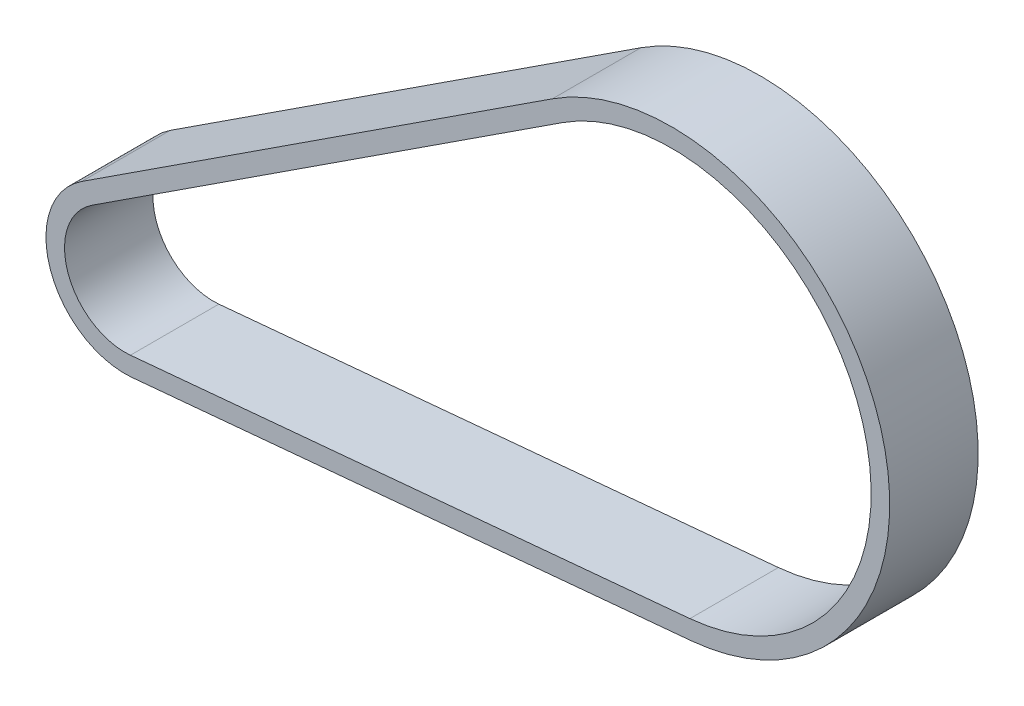
ISO-10303-21;
HEADER;
FILE_DESCRIPTION(('STEP AP214'),'2;1');
FILE_NAME('part.step','',(''),(''),'','','');
FILE_SCHEMA(('AUTOMOTIVE_DESIGN { 1 0 10303 214 1 1 1 1 }'));
ENDSEC;
DATA;
#1=APPLICATION_CONTEXT('core data for automotive mechanical design processes');
#2=APPLICATION_PROTOCOL_DEFINITION('international standard','automotive_design',2000,#1);
#3=PRODUCT_CONTEXT('',#1,'mechanical');
#4=PRODUCT('Part','Part','',(#3));
#5=PRODUCT_RELATED_PRODUCT_CATEGORY('part','',(#4));
#6=PRODUCT_DEFINITION_FORMATION('','',#4);
#7=PRODUCT_DEFINITION_CONTEXT('part definition',#1,'design');
#8=PRODUCT_DEFINITION('design','',#6,#7);
#9=PRODUCT_DEFINITION_SHAPE('','',#8);
#10=(LENGTH_UNIT() NAMED_UNIT(*) SI_UNIT(.MILLI.,.METRE.));
#11=(NAMED_UNIT(*) PLANE_ANGLE_UNIT() SI_UNIT($,.RADIAN.));
#12=(NAMED_UNIT(*) SI_UNIT($,.STERADIAN.) SOLID_ANGLE_UNIT());
#13=UNCERTAINTY_MEASURE_WITH_UNIT(LENGTH_MEASURE(1.E-05),#10,'distance_accuracy_value','');
#14=(GEOMETRIC_REPRESENTATION_CONTEXT(3) GLOBAL_UNCERTAINTY_ASSIGNED_CONTEXT((#13)) GLOBAL_UNIT_ASSIGNED_CONTEXT((#10,
#11,#12)) REPRESENTATION_CONTEXT('',''));
#15=CARTESIAN_POINT('',(0.,0.,0.));
#16=DIRECTION('',(0.,0.,1.));
#17=DIRECTION('',(1.,0.,0.));
#18=AXIS2_PLACEMENT_3D('',#15,#16,#17);
#19=CARTESIAN_POINT('',(0.,0.,9.53));
#20=DIRECTION('',(0.,0.,1.));
#21=DIRECTION('',(1.,0.,0.));
#22=AXIS2_PLACEMENT_3D('',#19,#20,#21);
#23=PLANE('',#22);
#24=CARTESIAN_POINT('',(0.,0.,9.53));
#25=DIRECTION('',(0.,0.,1.));
#26=DIRECTION('',(-1.,0.,0.));
#27=AXIS2_PLACEMENT_3D('',#24,#25,#26);
#28=CIRCLE('',#27,23.5);
#29=CARTESIAN_POINT('',(2.15978102303075,-23.4005415734883,9.53));
#30=VERTEX_POINT('',#29);
#31=CARTESIAN_POINT('',(-12.8359417240021,19.6847301240841,9.53));
#32=VERTEX_POINT('',#31);
#33=EDGE_CURVE('E160',#30,#32,#28,.T.);
#34=ORIENTED_EDGE('',*,*,#33,.T.);
#35=DIRECTION('',(-0.837648090386555,-0.546210286127749,0.));
#36=VECTOR('',#35,1.);
#37=CARTESIAN_POINT('',(-63.5427874320859,-13.3799912317143,9.53));
#38=LINE('',#37,#36);
#39=CARTESIAN_POINT('',(-63.5427874320859,-13.3799912317143,9.53));
#40=VERTEX_POINT('',#39);
#41=EDGE_CURVE('E163',#32,#40,#38,.T.);
#42=ORIENTED_EDGE('',*,*,#41,.T.);
#43=CARTESIAN_POINT('',(-58.9,-20.5,9.53));
#44=DIRECTION('',(0.,0.,1.));
#45=DIRECTION('',(-1.,0.,0.));
#46=AXIS2_PLACEMENT_3D('',#43,#44,#45);
#47=CIRCLE('',#46,8.5);
#48=CARTESIAN_POINT('',(-58.118802608691,-28.9640256755171,9.53));
#49=VERTEX_POINT('',#48);
#50=EDGE_CURVE('E166',#40,#49,#47,.T.);
#51=ORIENTED_EDGE('',*,*,#50,.T.);
#52=DIRECTION('',(0.995767726531419,0.091905575448117,0.));
#53=VECTOR('',#52,1.);
#54=CARTESIAN_POINT('',(2.15978102303075,-23.4005415734883,9.53));
#55=LINE('',#54,#53);
#56=EDGE_CURVE('E168',#49,#30,#55,.T.);
#57=ORIENTED_EDGE('',*,*,#56,.T.);
#58=EDGE_LOOP('',(#34,#42,#51,#57));
#59=FACE_BOUND('',#58,.T.);
#60=DIRECTION('',(-0.837648090386555,-0.546210286127749,0.));
#61=VECTOR('',#60,1.);
#62=CARTESIAN_POINT('',(-11.7435211517466,18.0094339433109,9.53));
#63=LINE('',#62,#61);
#64=CARTESIAN_POINT('',(-11.7435211517466,18.0094339433109,9.53));
#65=VERTEX_POINT('',#64);
#66=CARTESIAN_POINT('',(-62.4503668598304,-15.0552874124874,9.53));
#67=VERTEX_POINT('',#66);
#68=EDGE_CURVE('E132',#65,#67,#63,.T.);
#69=ORIENTED_EDGE('',*,*,#68,.F.);
#70=CARTESIAN_POINT('',(0.,0.,9.53));
#71=DIRECTION('',(0.,0.,-1.));
#72=DIRECTION('',(-1.,0.,0.));
#73=AXIS2_PLACEMENT_3D('',#70,#71,#72);
#74=CIRCLE('',#73,21.5);
#75=CARTESIAN_POINT('',(1.97596987213452,-21.4090061204255,9.53));
#76=VERTEX_POINT('',#75);
#77=EDGE_CURVE('E124',#76,#65,#74,.F.);
#78=ORIENTED_EDGE('',*,*,#77,.F.);
#79=DIRECTION('',(0.995767726531419,0.091905575448117,0.));
#80=VECTOR('',#79,1.);
#81=CARTESIAN_POINT('',(1.97596987213452,-21.4090061204255,9.53));
#82=LINE('',#81,#80);
#83=CARTESIAN_POINT('',(-58.3026137595872,-26.9724902224542,9.53));
#84=VERTEX_POINT('',#83);
#85=EDGE_CURVE('E146',#84,#76,#82,.T.);
#86=ORIENTED_EDGE('',*,*,#85,.F.);
#87=CARTESIAN_POINT('',(-58.9,-20.5,9.53));
#88=DIRECTION('',(0.,0.,-1.));
#89=DIRECTION('',(-1.,0.,0.));
#90=AXIS2_PLACEMENT_3D('',#87,#88,#89);
#91=CIRCLE('',#90,6.5);
#92=EDGE_CURVE('E144',#67,#84,#91,.F.);
#93=ORIENTED_EDGE('',*,*,#92,.F.);
#94=EDGE_LOOP('',(#69,#78,#86,#93));
#95=FACE_BOUND('',#94,.T.);
#96=ADVANCED_FACE('F59',(#59,#95),#23,.T.);
#97=CARTESIAN_POINT('',(0.,0.,0.));
#98=DIRECTION('',(0.,0.,1.));
#99=DIRECTION('',(1.,0.,0.));
#100=AXIS2_PLACEMENT_3D('',#97,#98,#99);
#101=PLANE('',#100);
#102=CARTESIAN_POINT('',(0.,0.,0.));
#103=DIRECTION('',(0.,0.,1.));
#104=DIRECTION('',(-1.,0.,0.));
#105=AXIS2_PLACEMENT_3D('',#102,#103,#104);
#106=CIRCLE('',#105,23.5);
#107=CARTESIAN_POINT('',(2.15978102303075,-23.4005415734883,0.));
#108=VERTEX_POINT('',#107);
#109=CARTESIAN_POINT('',(-12.8359417240021,19.6847301240841,0.));
#110=VERTEX_POINT('',#109);
#111=EDGE_CURVE('E140',#108,#110,#106,.T.);
#112=ORIENTED_EDGE('',*,*,#111,.F.);
#113=DIRECTION('',(0.995767726531419,0.091905575448117,0.));
#114=VECTOR('',#113,1.);
#115=CARTESIAN_POINT('',(2.15978102303075,-23.4005415734883,0.));
#116=LINE('',#115,#114);
#117=CARTESIAN_POINT('',(-58.118802608691,-28.9640256755171,0.));
#118=VERTEX_POINT('',#117);
#119=EDGE_CURVE('E164',#118,#108,#116,.T.);
#120=ORIENTED_EDGE('',*,*,#119,.F.);
#121=CARTESIAN_POINT('',(-58.9,-20.5,0.));
#122=DIRECTION('',(0.,0.,1.));
#123=DIRECTION('',(-1.,0.,0.));
#124=AXIS2_PLACEMENT_3D('',#121,#122,#123);
#125=CIRCLE('',#124,8.5);
#126=CARTESIAN_POINT('',(-63.5427874320859,-13.3799912317143,0.));
#127=VERTEX_POINT('',#126);
#128=EDGE_CURVE('E175',#127,#118,#125,.T.);
#129=ORIENTED_EDGE('',*,*,#128,.F.);
#130=DIRECTION('',(-0.837648090386555,-0.546210286127749,0.));
#131=VECTOR('',#130,1.);
#132=CARTESIAN_POINT('',(-63.5427874320859,-13.3799912317143,0.));
#133=LINE('',#132,#131);
#134=EDGE_CURVE('E173',#110,#127,#133,.T.);
#135=ORIENTED_EDGE('',*,*,#134,.F.);
#136=EDGE_LOOP('',(#112,#120,#129,#135));
#137=FACE_BOUND('',#136,.T.);
#138=CARTESIAN_POINT('',(0.,0.,0.));
#139=DIRECTION('',(0.,0.,-1.));
#140=DIRECTION('',(-1.,0.,0.));
#141=AXIS2_PLACEMENT_3D('',#138,#139,#140);
#142=CIRCLE('',#141,21.5);
#143=CARTESIAN_POINT('',(1.97596987213452,-21.4090061204255,0.));
#144=VERTEX_POINT('',#143);
#145=CARTESIAN_POINT('',(-11.7435211517466,18.0094339433109,0.));
#146=VERTEX_POINT('',#145);
#147=EDGE_CURVE('E82',#144,#146,#142,.F.);
#148=ORIENTED_EDGE('',*,*,#147,.T.);
#149=DIRECTION('',(-0.837648090386555,-0.546210286127749,0.));
#150=VECTOR('',#149,1.);
#151=CARTESIAN_POINT('',(-11.7435211517466,18.0094339433109,0.));
#152=LINE('',#151,#150);
#153=CARTESIAN_POINT('',(-62.4503668598304,-15.0552874124874,0.));
#154=VERTEX_POINT('',#153);
#155=EDGE_CURVE('E139',#146,#154,#152,.T.);
#156=ORIENTED_EDGE('',*,*,#155,.T.);
#157=CARTESIAN_POINT('',(-58.9,-20.5,0.));
#158=DIRECTION('',(0.,0.,-1.));
#159=DIRECTION('',(-1.,0.,0.));
#160=AXIS2_PLACEMENT_3D('',#157,#158,#159);
#161=CIRCLE('',#160,6.5);
#162=CARTESIAN_POINT('',(-58.3026137595872,-26.9724902224542,0.));
#163=VERTEX_POINT('',#162);
#164=EDGE_CURVE('E152',#154,#163,#161,.F.);
#165=ORIENTED_EDGE('',*,*,#164,.T.);
#166=DIRECTION('',(0.995767726531419,0.091905575448117,0.));
#167=VECTOR('',#166,1.);
#168=CARTESIAN_POINT('',(1.97596987213452,-21.4090061204255,0.));
#169=LINE('',#168,#167);
#170=EDGE_CURVE('E133',#163,#144,#169,.T.);
#171=ORIENTED_EDGE('',*,*,#170,.T.);
#172=EDGE_LOOP('',(#148,#156,#165,#171));
#173=FACE_BOUND('',#172,.T.);
#174=ADVANCED_FACE('F193',(#137,#173),#101,.F.);
#175=CARTESIAN_POINT('',(0.,0.,9.53));
#176=DIRECTION('',(0.,0.,-1.));
#177=DIRECTION('',(-1.,0.,0.));
#178=AXIS2_PLACEMENT_3D('',#175,#176,#177);
#179=CYLINDRICAL_SURFACE('',#178,23.5);
#180=ORIENTED_EDGE('',*,*,#111,.T.);
#181=DIRECTION('',(0.,0.,-1.));
#182=VECTOR('',#181,1.);
#183=CARTESIAN_POINT('',(-12.8359417240021,19.6847301240841,9.53));
#184=LINE('',#183,#182);
#185=EDGE_CURVE('E12',#32,#110,#184,.T.);
#186=ORIENTED_EDGE('',*,*,#185,.F.);
#187=ORIENTED_EDGE('',*,*,#33,.F.);
#188=DIRECTION('',(0.,0.,-1.));
#189=VECTOR('',#188,1.);
#190=CARTESIAN_POINT('',(2.15978102303075,-23.4005415734883,9.53));
#191=LINE('',#190,#189);
#192=EDGE_CURVE('E170',#30,#108,#191,.T.);
#193=ORIENTED_EDGE('',*,*,#192,.T.);
#194=EDGE_LOOP('',(#180,#186,#187,#193));
#195=FACE_BOUND('',#194,.T.);
#196=ADVANCED_FACE('F61',(#195),#179,.T.);
#197=CARTESIAN_POINT('',(-63.5427874320859,-13.3799912317143,9.53));
#198=DIRECTION('',(0.546210286127749,-0.837648090386555,0.));
#199=DIRECTION('',(0.837648090386555,0.546210286127749,0.));
#200=AXIS2_PLACEMENT_3D('',#197,#198,#199);
#201=PLANE('',#200);
#202=ORIENTED_EDGE('',*,*,#134,.T.);
#203=DIRECTION('',(0.,0.,-1.));
#204=VECTOR('',#203,1.);
#205=CARTESIAN_POINT('',(-63.5427874320859,-13.3799912317143,9.53));
#206=LINE('',#205,#204);
#207=EDGE_CURVE('E67',#40,#127,#206,.T.);
#208=ORIENTED_EDGE('',*,*,#207,.F.);
#209=ORIENTED_EDGE('',*,*,#41,.F.);
#210=ORIENTED_EDGE('',*,*,#185,.T.);
#211=EDGE_LOOP('',(#202,#208,#209,#210));
#212=FACE_BOUND('',#211,.T.);
#213=ADVANCED_FACE('F203',(#212),#201,.F.);
#214=CARTESIAN_POINT('',(-58.9,-20.5,9.53));
#215=DIRECTION('',(0.,0.,-1.));
#216=DIRECTION('',(-1.,0.,0.));
#217=AXIS2_PLACEMENT_3D('',#214,#215,#216);
#218=CYLINDRICAL_SURFACE('',#217,8.5);
#219=ORIENTED_EDGE('',*,*,#128,.T.);
#220=DIRECTION('',(0.,0.,-1.));
#221=VECTOR('',#220,1.);
#222=CARTESIAN_POINT('',(-58.118802608691,-28.9640256755171,9.53));
#223=LINE('',#222,#221);
#224=EDGE_CURVE('E180',#49,#118,#223,.T.);
#225=ORIENTED_EDGE('',*,*,#224,.F.);
#226=ORIENTED_EDGE('',*,*,#50,.F.);
#227=ORIENTED_EDGE('',*,*,#207,.T.);
#228=EDGE_LOOP('',(#219,#225,#226,#227));
#229=FACE_BOUND('',#228,.T.);
#230=ADVANCED_FACE('F187',(#229),#218,.T.);
#231=CARTESIAN_POINT('',(2.15978102303075,-23.4005415734883,9.53));
#232=DIRECTION('',(-0.091905575448117,0.995767726531419,0.));
#233=DIRECTION('',(-0.995767726531419,-0.091905575448117,0.));
#234=AXIS2_PLACEMENT_3D('',#231,#232,#233);
#235=PLANE('',#234);
#236=ORIENTED_EDGE('',*,*,#119,.T.);
#237=ORIENTED_EDGE('',*,*,#192,.F.);
#238=ORIENTED_EDGE('',*,*,#56,.F.);
#239=ORIENTED_EDGE('',*,*,#224,.T.);
#240=EDGE_LOOP('',(#236,#237,#238,#239));
#241=FACE_BOUND('',#240,.T.);
#242=ADVANCED_FACE('F197',(#241),#235,.F.);
#243=CARTESIAN_POINT('',(0.,0.,9.53));
#244=DIRECTION('',(0.,0.,-1.));
#245=DIRECTION('',(-1.,0.,0.));
#246=AXIS2_PLACEMENT_3D('',#243,#244,#245);
#247=CYLINDRICAL_SURFACE('',#246,21.5);
#248=ORIENTED_EDGE('',*,*,#147,.F.);
#249=DIRECTION('',(0.,0.,-1.));
#250=VECTOR('',#249,1.);
#251=CARTESIAN_POINT('',(1.97596987213452,-21.4090061204255,9.53));
#252=LINE('',#251,#250);
#253=EDGE_CURVE('E128',#76,#144,#252,.T.);
#254=ORIENTED_EDGE('',*,*,#253,.F.);
#255=ORIENTED_EDGE('',*,*,#77,.T.);
#256=DIRECTION('',(0.,0.,-1.));
#257=VECTOR('',#256,1.);
#258=CARTESIAN_POINT('',(-11.7435211517466,18.0094339433109,9.53));
#259=LINE('',#258,#257);
#260=EDGE_CURVE('E127',#65,#146,#259,.T.);
#261=ORIENTED_EDGE('',*,*,#260,.T.);
#262=EDGE_LOOP('',(#248,#254,#255,#261));
#263=FACE_BOUND('',#262,.T.);
#264=ADVANCED_FACE('F126',(#263),#247,.F.);
#265=CARTESIAN_POINT('',(-11.7435211517466,18.0094339433109,9.53));
#266=DIRECTION('',(0.546210286127749,-0.837648090386555,0.));
#267=DIRECTION('',(0.837648090386555,0.546210286127749,0.));
#268=AXIS2_PLACEMENT_3D('',#265,#266,#267);
#269=PLANE('',#268);
#270=ORIENTED_EDGE('',*,*,#155,.F.);
#271=ORIENTED_EDGE('',*,*,#260,.F.);
#272=ORIENTED_EDGE('',*,*,#68,.T.);
#273=DIRECTION('',(0.,0.,-1.));
#274=VECTOR('',#273,1.);
#275=CARTESIAN_POINT('',(-62.4503668598304,-15.0552874124874,9.53));
#276=LINE('',#275,#274);
#277=EDGE_CURVE('E141',#67,#154,#276,.T.);
#278=ORIENTED_EDGE('',*,*,#277,.T.);
#279=EDGE_LOOP('',(#270,#271,#272,#278));
#280=FACE_BOUND('',#279,.T.);
#281=ADVANCED_FACE('F136',(#280),#269,.T.);
#282=CARTESIAN_POINT('',(-58.9,-20.5,9.53));
#283=DIRECTION('',(0.,0.,-1.));
#284=DIRECTION('',(-1.,0.,0.));
#285=AXIS2_PLACEMENT_3D('',#282,#283,#284);
#286=CYLINDRICAL_SURFACE('',#285,6.5);
#287=ORIENTED_EDGE('',*,*,#164,.F.);
#288=ORIENTED_EDGE('',*,*,#277,.F.);
#289=ORIENTED_EDGE('',*,*,#92,.T.);
#290=DIRECTION('',(0.,0.,-1.));
#291=VECTOR('',#290,1.);
#292=CARTESIAN_POINT('',(-58.3026137595872,-26.9724902224542,9.53));
#293=LINE('',#292,#291);
#294=EDGE_CURVE('E74',#84,#163,#293,.T.);
#295=ORIENTED_EDGE('',*,*,#294,.T.);
#296=EDGE_LOOP('',(#287,#288,#289,#295));
#297=FACE_BOUND('',#296,.T.);
#298=ADVANCED_FACE('F226',(#297),#286,.F.);
#299=CARTESIAN_POINT('',(1.97596987213452,-21.4090061204255,9.53));
#300=DIRECTION('',(-0.091905575448117,0.995767726531419,0.));
#301=DIRECTION('',(-0.995767726531419,-0.091905575448117,0.));
#302=AXIS2_PLACEMENT_3D('',#299,#300,#301);
#303=PLANE('',#302);
#304=ORIENTED_EDGE('',*,*,#170,.F.);
#305=ORIENTED_EDGE('',*,*,#294,.F.);
#306=ORIENTED_EDGE('',*,*,#85,.T.);
#307=ORIENTED_EDGE('',*,*,#253,.T.);
#308=EDGE_LOOP('',(#304,#305,#306,#307));
#309=FACE_BOUND('',#308,.T.);
#310=ADVANCED_FACE('F230',(#309),#303,.T.);
#311=CLOSED_SHELL('',(#96,#174,#196,#213,#230,#242,#264,#281,#298,#310));
#312=MANIFOLD_SOLID_BREP('B2',#311);
#313=ADVANCED_BREP_SHAPE_REPRESENTATION('',(#18,#312),#14);
#314=SHAPE_DEFINITION_REPRESENTATION(#9,#313);
ENDSEC;
END-ISO-10303-21;
